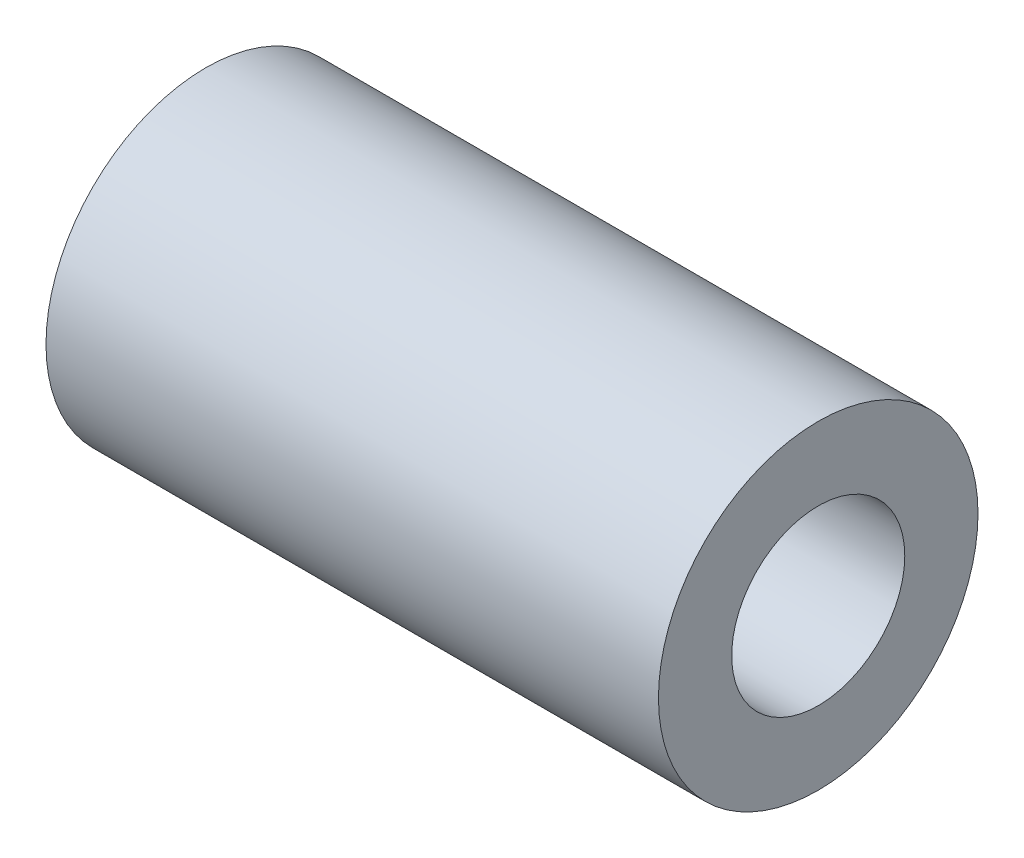
ISO-10303-21;
HEADER;
FILE_DESCRIPTION(('STEP AP214'),'2;1');
FILE_NAME('part.step','',(''),(''),'','','');
FILE_SCHEMA(('AUTOMOTIVE_DESIGN { 1 0 10303 214 1 1 1 1 }'));
ENDSEC;
DATA;
#1=APPLICATION_CONTEXT('core data for automotive mechanical design processes');
#2=APPLICATION_PROTOCOL_DEFINITION('international standard','automotive_design',2000,#1);
#3=PRODUCT_CONTEXT('',#1,'mechanical');
#4=PRODUCT('Part','Part','',(#3));
#5=PRODUCT_RELATED_PRODUCT_CATEGORY('part','',(#4));
#6=PRODUCT_DEFINITION_FORMATION('','',#4);
#7=PRODUCT_DEFINITION_CONTEXT('part definition',#1,'design');
#8=PRODUCT_DEFINITION('design','',#6,#7);
#9=PRODUCT_DEFINITION_SHAPE('','',#8);
#10=(LENGTH_UNIT() NAMED_UNIT(*) SI_UNIT(.MILLI.,.METRE.));
#11=(NAMED_UNIT(*) PLANE_ANGLE_UNIT() SI_UNIT($,.RADIAN.));
#12=(NAMED_UNIT(*) SI_UNIT($,.STERADIAN.) SOLID_ANGLE_UNIT());
#13=UNCERTAINTY_MEASURE_WITH_UNIT(LENGTH_MEASURE(1.E-05),#10,'distance_accuracy_value','');
#14=(GEOMETRIC_REPRESENTATION_CONTEXT(3) GLOBAL_UNCERTAINTY_ASSIGNED_CONTEXT((#13)) GLOBAL_UNIT_ASSIGNED_CONTEXT((#10,
#11,#12)) REPRESENTATION_CONTEXT('',''));
#15=CARTESIAN_POINT('',(0.,0.,0.));
#16=DIRECTION('',(0.,0.,1.));
#17=DIRECTION('',(1.,0.,0.));
#18=AXIS2_PLACEMENT_3D('',#15,#16,#17);
#19=CARTESIAN_POINT('',(-11.5,3.25,0.));
#20=DIRECTION('',(-1.,0.,0.));
#21=DIRECTION('',(0.,0.,1.));
#22=AXIS2_PLACEMENT_3D('',#19,#20,#21);
#23=PLANE('',#22);
#24=CARTESIAN_POINT('',(-11.5,0.,0.));
#25=DIRECTION('',(1.,0.,0.));
#26=DIRECTION('',(0.,0.,-1.));
#27=AXIS2_PLACEMENT_3D('',#24,#25,#26);
#28=CIRCLE('',#27,3.25);
#29=CARTESIAN_POINT('',(-11.5,0.,-3.25));
#30=VERTEX_POINT('',#29);
#31=EDGE_CURVE('E51',#30,#30,#28,.T.);
#32=ORIENTED_EDGE('',*,*,#31,.T.);
#33=EDGE_LOOP('',(#32));
#34=FACE_BOUND('',#33,.T.);
#35=CARTESIAN_POINT('',(-11.5,0.,0.));
#36=DIRECTION('',(1.,0.,0.));
#37=DIRECTION('',(0.,0.,-1.));
#38=AXIS2_PLACEMENT_3D('',#35,#36,#37);
#39=CIRCLE('',#38,6.);
#40=CARTESIAN_POINT('',(-11.5,0.,-6.));
#41=VERTEX_POINT('',#40);
#42=EDGE_CURVE('E10',#41,#41,#39,.T.);
#43=ORIENTED_EDGE('',*,*,#42,.F.);
#44=EDGE_LOOP('',(#43));
#45=FACE_BOUND('',#44,.T.);
#46=ADVANCED_FACE('F37',(#34,#45),#23,.T.);
#47=CARTESIAN_POINT('',(0.,0.,0.));
#48=DIRECTION('',(1.,0.,0.));
#49=DIRECTION('',(0.,0.,-1.));
#50=AXIS2_PLACEMENT_3D('',#47,#48,#49);
#51=CYLINDRICAL_SURFACE('',#50,6.);
#52=ORIENTED_EDGE('',*,*,#42,.T.);
#53=EDGE_LOOP('',(#52));
#54=FACE_BOUND('',#53,.T.);
#55=CARTESIAN_POINT('',(11.5,0.,0.));
#56=DIRECTION('',(1.,0.,0.));
#57=DIRECTION('',(0.,0.,-1.));
#58=AXIS2_PLACEMENT_3D('',#55,#56,#57);
#59=CIRCLE('',#58,6.);
#60=CARTESIAN_POINT('',(11.5,0.,-6.));
#61=VERTEX_POINT('',#60);
#62=EDGE_CURVE('E43',#61,#61,#59,.T.);
#63=ORIENTED_EDGE('',*,*,#62,.F.);
#64=EDGE_LOOP('',(#63));
#65=FACE_BOUND('',#64,.T.);
#66=ADVANCED_FACE('F67',(#54,#65),#51,.T.);
#67=CARTESIAN_POINT('',(11.5,6.,0.));
#68=DIRECTION('',(1.,0.,0.));
#69=DIRECTION('',(0.,0.,-1.));
#70=AXIS2_PLACEMENT_3D('',#67,#68,#69);
#71=PLANE('',#70);
#72=ORIENTED_EDGE('',*,*,#62,.T.);
#73=EDGE_LOOP('',(#72));
#74=FACE_BOUND('',#73,.T.);
#75=CARTESIAN_POINT('',(11.5,0.,0.));
#76=DIRECTION('',(1.,0.,0.));
#77=DIRECTION('',(0.,0.,-1.));
#78=AXIS2_PLACEMENT_3D('',#75,#76,#77);
#79=CIRCLE('',#78,3.25);
#80=CARTESIAN_POINT('',(11.5,0.,-3.25));
#81=VERTEX_POINT('',#80);
#82=EDGE_CURVE('E47',#81,#81,#79,.T.);
#83=ORIENTED_EDGE('',*,*,#82,.F.);
#84=EDGE_LOOP('',(#83));
#85=FACE_BOUND('',#84,.T.);
#86=ADVANCED_FACE('F61',(#74,#85),#71,.T.);
#87=CARTESIAN_POINT('',(0.,0.,0.));
#88=DIRECTION('',(1.,0.,0.));
#89=DIRECTION('',(0.,0.,-1.));
#90=AXIS2_PLACEMENT_3D('',#87,#88,#89);
#91=CYLINDRICAL_SURFACE('',#90,3.25);
#92=ORIENTED_EDGE('',*,*,#82,.T.);
#93=EDGE_LOOP('',(#92));
#94=FACE_BOUND('',#93,.T.);
#95=ORIENTED_EDGE('',*,*,#31,.F.);
#96=EDGE_LOOP('',(#95));
#97=FACE_BOUND('',#96,.T.);
#98=ADVANCED_FACE('F59',(#94,#97),#91,.F.);
#99=CLOSED_SHELL('',(#46,#66,#86,#98));
#100=MANIFOLD_SOLID_BREP('B2',#99);
#101=ADVANCED_BREP_SHAPE_REPRESENTATION('',(#18,#100),#14);
#102=SHAPE_DEFINITION_REPRESENTATION(#9,#101);
ENDSEC;
END-ISO-10303-21;
